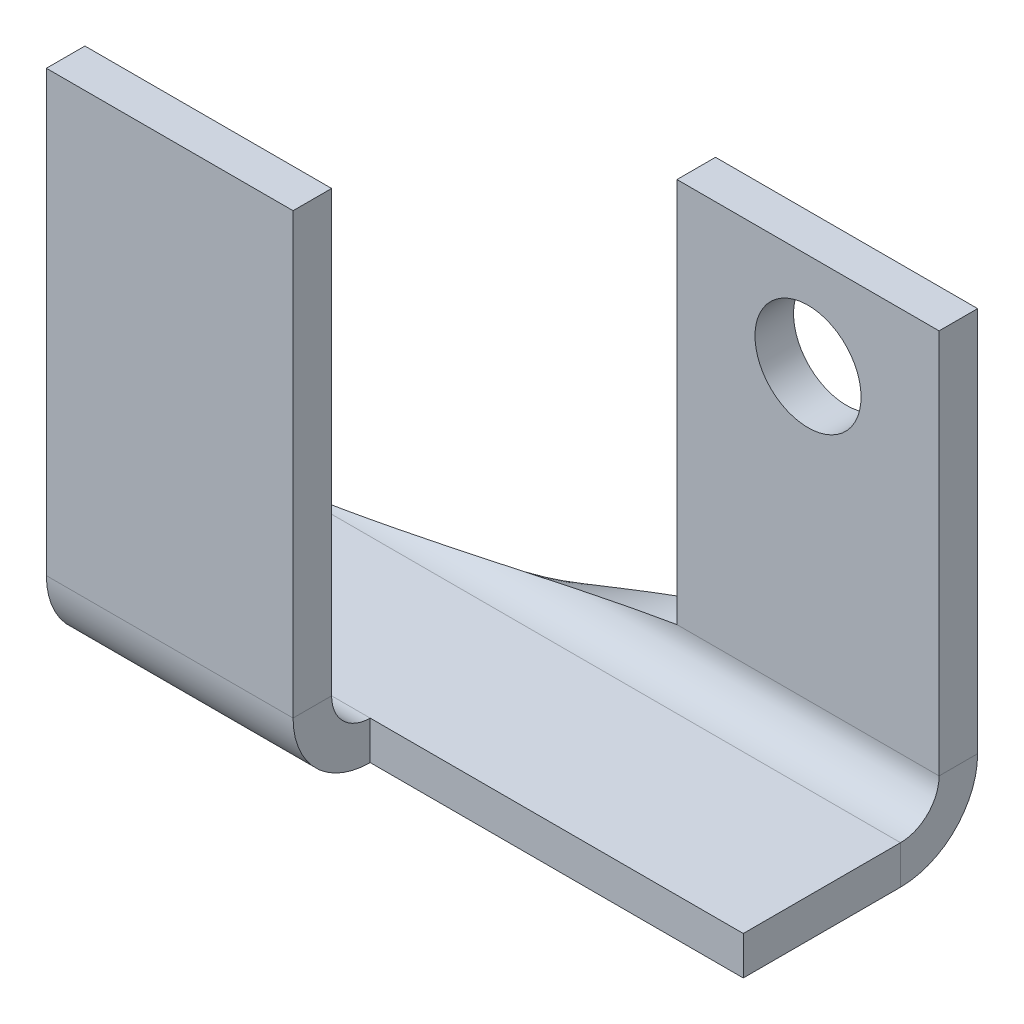
ISO-10303-21;
HEADER;
FILE_DESCRIPTION(('STEP AP214'),'2;1');
FILE_NAME('part.step','',(''),(''),'','','');
FILE_SCHEMA(('AUTOMOTIVE_DESIGN { 1 0 10303 214 1 1 1 1 }'));
ENDSEC;
DATA;
#1=APPLICATION_CONTEXT('core data for automotive mechanical design processes');
#2=APPLICATION_PROTOCOL_DEFINITION('international standard','automotive_design',2000,#1);
#3=PRODUCT_CONTEXT('',#1,'mechanical');
#4=PRODUCT('Part','Part','',(#3));
#5=PRODUCT_RELATED_PRODUCT_CATEGORY('part','',(#4));
#6=PRODUCT_DEFINITION_FORMATION('','',#4);
#7=PRODUCT_DEFINITION_CONTEXT('part definition',#1,'design');
#8=PRODUCT_DEFINITION('design','',#6,#7);
#9=PRODUCT_DEFINITION_SHAPE('','',#8);
#10=(LENGTH_UNIT() NAMED_UNIT(*) SI_UNIT(.MILLI.,.METRE.));
#11=(NAMED_UNIT(*) PLANE_ANGLE_UNIT() SI_UNIT($,.RADIAN.));
#12=(NAMED_UNIT(*) SI_UNIT($,.STERADIAN.) SOLID_ANGLE_UNIT());
#13=UNCERTAINTY_MEASURE_WITH_UNIT(LENGTH_MEASURE(1.E-05),#10,'distance_accuracy_value','');
#14=(GEOMETRIC_REPRESENTATION_CONTEXT(3) GLOBAL_UNCERTAINTY_ASSIGNED_CONTEXT((#13)) GLOBAL_UNIT_ASSIGNED_CONTEXT((#10,
#11,#12)) REPRESENTATION_CONTEXT('',''));
#15=CARTESIAN_POINT('',(0.,0.,0.));
#16=DIRECTION('',(0.,0.,1.));
#17=DIRECTION('',(1.,0.,0.));
#18=AXIS2_PLACEMENT_3D('',#15,#16,#17);
#19=CARTESIAN_POINT('',(10.795,19.05,3.175));
#20=DIRECTION('',(1.,0.,0.));
#21=DIRECTION('',(0.,1.,0.));
#22=AXIS2_PLACEMENT_3D('',#19,#20,#21);
#23=PLANE('',#22);
#24=DIRECTION('',(0.,1.,0.));
#25=VECTOR('',#24,1.);
#26=CARTESIAN_POINT('',(10.795,19.05,3.175));
#27=LINE('',#26,#25);
#28=CARTESIAN_POINT('',(10.795,-12.7,3.175));
#29=VERTEX_POINT('',#28);
#30=CARTESIAN_POINT('',(10.795,19.05,3.175));
#31=VERTEX_POINT('',#30);
#32=EDGE_CURVE('E357',#29,#31,#27,.T.);
#33=ORIENTED_EDGE('',*,*,#32,.F.);
#34=DIRECTION('',(0.,0.,-1.));
#35=VECTOR('',#34,1.);
#36=CARTESIAN_POINT('',(10.795,-12.7,3.175));
#37=LINE('',#36,#35);
#38=CARTESIAN_POINT('',(10.795,-12.7,0.));
#39=VERTEX_POINT('',#38);
#40=EDGE_CURVE('E278',#29,#39,#37,.T.);
#41=ORIENTED_EDGE('',*,*,#40,.T.);
#42=DIRECTION('',(0.,1.,0.));
#43=VECTOR('',#42,1.);
#44=CARTESIAN_POINT('',(10.795,0.,0.));
#45=LINE('',#44,#43);
#46=CARTESIAN_POINT('',(10.795,19.05,0.));
#47=VERTEX_POINT('',#46);
#48=EDGE_CURVE('E281',#39,#47,#45,.T.);
#49=ORIENTED_EDGE('',*,*,#48,.T.);
#50=DIRECTION('',(0.,0.,1.));
#51=VECTOR('',#50,1.);
#52=CARTESIAN_POINT('',(10.795,19.05,3.175));
#53=LINE('',#52,#51);
#54=EDGE_CURVE('E83',#47,#31,#53,.T.);
#55=ORIENTED_EDGE('',*,*,#54,.T.);
#56=EDGE_LOOP('',(#33,#41,#49,#55));
#57=FACE_BOUND('',#56,.T.);
#58=ADVANCED_FACE('F79',(#57),#23,.T.);
#59=CARTESIAN_POINT('',(0.,0.,3.175));
#60=DIRECTION('',(0.,0.,1.));
#61=DIRECTION('',(1.,0.,0.));
#62=AXIS2_PLACEMENT_3D('',#59,#60,#61);
#63=PLANE('',#62);
#64=CARTESIAN_POINT('',(0.,11.1125,3.175));
#65=DIRECTION('',(0.,0.,1.));
#66=DIRECTION('',(1.,0.,0.));
#67=AXIS2_PLACEMENT_3D('',#64,#65,#66);
#68=CIRCLE('',#67,4.3688);
#69=CARTESIAN_POINT('',(4.3688,11.1125,3.175));
#70=VERTEX_POINT('',#69);
#71=EDGE_CURVE('E366',#70,#70,#68,.T.);
#72=ORIENTED_EDGE('',*,*,#71,.F.);
#73=EDGE_LOOP('',(#72));
#74=FACE_BOUND('',#73,.T.);
#75=DIRECTION('',(0.,-1.,0.));
#76=VECTOR('',#75,1.);
#77=CARTESIAN_POINT('',(-10.795,19.05,3.175));
#78=LINE('',#77,#76);
#79=CARTESIAN_POINT('',(-10.795,19.05,3.175));
#80=VERTEX_POINT('',#79);
#81=CARTESIAN_POINT('',(-10.795,-12.7,3.175));
#82=VERTEX_POINT('',#81);
#83=EDGE_CURVE('E362',#80,#82,#78,.T.);
#84=ORIENTED_EDGE('',*,*,#83,.T.);
#85=DIRECTION('',(1.,0.,0.));
#86=VECTOR('',#85,1.);
#87=CARTESIAN_POINT('',(10.795,-12.7,3.175));
#88=LINE('',#87,#86);
#89=EDGE_CURVE('E273',#29,#82,#88,.F.);
#90=ORIENTED_EDGE('',*,*,#89,.F.);
#91=ORIENTED_EDGE('',*,*,#32,.T.);
#92=DIRECTION('',(-1.,0.,0.));
#93=VECTOR('',#92,1.);
#94=CARTESIAN_POINT('',(-10.795,19.05,3.175));
#95=LINE('',#94,#93);
#96=EDGE_CURVE('E360',#31,#80,#95,.T.);
#97=ORIENTED_EDGE('',*,*,#96,.T.);
#98=EDGE_LOOP('',(#84,#90,#91,#97));
#99=FACE_BOUND('',#98,.T.);
#100=ADVANCED_FACE('F319',(#74,#99),#63,.T.);
#101=CARTESIAN_POINT('',(0.,0.,0.));
#102=DIRECTION('',(0.,0.,1.));
#103=DIRECTION('',(1.,0.,0.));
#104=AXIS2_PLACEMENT_3D('',#101,#102,#103);
#105=PLANE('',#104);
#106=CARTESIAN_POINT('',(0.,11.1125,0.));
#107=DIRECTION('',(0.,0.,1.));
#108=DIRECTION('',(1.,0.,0.));
#109=AXIS2_PLACEMENT_3D('',#106,#107,#108);
#110=CIRCLE('',#109,4.3688);
#111=CARTESIAN_POINT('',(4.3688,11.1125,0.));
#112=VERTEX_POINT('',#111);
#113=EDGE_CURVE('E352',#112,#112,#110,.T.);
#114=ORIENTED_EDGE('',*,*,#113,.T.);
#115=EDGE_LOOP('',(#114));
#116=FACE_BOUND('',#115,.T.);
#117=DIRECTION('',(1.,0.,0.));
#118=VECTOR('',#117,1.);
#119=CARTESIAN_POINT('',(10.795,-12.7,0.));
#120=LINE('',#119,#118);
#121=CARTESIAN_POINT('',(-10.795,-12.7,0.));
#122=VERTEX_POINT('',#121);
#123=EDGE_CURVE('E269',#39,#122,#120,.F.);
#124=ORIENTED_EDGE('',*,*,#123,.T.);
#125=DIRECTION('',(0.,1.,0.));
#126=VECTOR('',#125,1.);
#127=CARTESIAN_POINT('',(-10.795,0.,0.));
#128=LINE('',#127,#126);
#129=CARTESIAN_POINT('',(-10.795,19.05,0.));
#130=VERTEX_POINT('',#129);
#131=EDGE_CURVE('E350',#130,#122,#128,.F.);
#132=ORIENTED_EDGE('',*,*,#131,.F.);
#133=DIRECTION('',(1.,0.,0.));
#134=VECTOR('',#133,1.);
#135=CARTESIAN_POINT('',(0.,19.05,0.));
#136=LINE('',#135,#134);
#137=EDGE_CURVE('E343',#47,#130,#136,.F.);
#138=ORIENTED_EDGE('',*,*,#137,.F.);
#139=ORIENTED_EDGE('',*,*,#48,.F.);
#140=EDGE_LOOP('',(#124,#132,#138,#139));
#141=FACE_BOUND('',#140,.T.);
#142=ADVANCED_FACE('F325',(#116,#141),#105,.F.);
#143=CARTESIAN_POINT('',(-10.795,19.05,3.175));
#144=DIRECTION('',(-1.,0.,0.));
#145=DIRECTION('',(0.,-1.,0.));
#146=AXIS2_PLACEMENT_3D('',#143,#144,#145);
#147=PLANE('',#146);
#148=DIRECTION('',(0.,0.,-1.));
#149=VECTOR('',#148,1.);
#150=CARTESIAN_POINT('',(-10.795,-12.7,3.175));
#151=LINE('',#150,#149);
#152=EDGE_CURVE('E102',#82,#122,#151,.T.);
#153=ORIENTED_EDGE('',*,*,#152,.F.);
#154=ORIENTED_EDGE('',*,*,#83,.F.);
#155=DIRECTION('',(0.,0.,1.));
#156=VECTOR('',#155,1.);
#157=CARTESIAN_POINT('',(-10.795,19.05,3.175));
#158=LINE('',#157,#156);
#159=EDGE_CURVE('E13',#130,#80,#158,.T.);
#160=ORIENTED_EDGE('',*,*,#159,.F.);
#161=ORIENTED_EDGE('',*,*,#131,.T.);
#162=EDGE_LOOP('',(#153,#154,#160,#161));
#163=FACE_BOUND('',#162,.T.);
#164=ADVANCED_FACE('F331',(#163),#147,.T.);
#165=CARTESIAN_POINT('',(-10.795,19.05,3.175));
#166=DIRECTION('',(0.,1.,0.));
#167=DIRECTION('',(-1.,0.,0.));
#168=AXIS2_PLACEMENT_3D('',#165,#166,#167);
#169=PLANE('',#168);
#170=ORIENTED_EDGE('',*,*,#137,.T.);
#171=ORIENTED_EDGE('',*,*,#159,.T.);
#172=ORIENTED_EDGE('',*,*,#96,.F.);
#173=ORIENTED_EDGE('',*,*,#54,.F.);
#174=EDGE_LOOP('',(#170,#171,#172,#173));
#175=FACE_BOUND('',#174,.T.);
#176=ADVANCED_FACE('F333',(#175),#169,.T.);
#177=CARTESIAN_POINT('',(0.,11.1125,3.175));
#178=DIRECTION('',(0.,0.,1.));
#179=DIRECTION('',(1.,0.,0.));
#180=AXIS2_PLACEMENT_3D('',#177,#178,#179);
#181=CYLINDRICAL_SURFACE('',#180,4.3688);
#182=ORIENTED_EDGE('',*,*,#71,.T.);
#183=EDGE_LOOP('',(#182));
#184=FACE_BOUND('',#183,.T.);
#185=ORIENTED_EDGE('',*,*,#113,.F.);
#186=EDGE_LOOP('',(#185));
#187=FACE_BOUND('',#186,.T.);
#188=ADVANCED_FACE('F81',(#184,#187),#181,.F.);
#189=CARTESIAN_POINT('',(-10.795,-12.7,-0.0317499999999983));
#190=CARTESIAN_POINT('',(-13.2503791831293,-13.5353846641155,-0.0317499999999983));
#191=CARTESIAN_POINT('',(-15.7056666666667,-14.3704095610098,0.134349870671977));
#192=CARTESIAN_POINT('',(-20.6163333333333,-15.913970427982,0.773713716120212));
#193=CARTESIAN_POINT('',(-23.0716666666667,-16.6218835301999,1.24672612852541));
#194=CARTESIAN_POINT('',(-27.9823333333333,-17.8032738714746,2.42811646980008));
#195=CARTESIAN_POINT('',(-30.4376666666667,-18.2762862838798,3.136029572018));
#196=CARTESIAN_POINT('',(-35.3483333333333,-18.915650129328,4.67959043899015));
#197=CARTESIAN_POINT('',(-37.8036208168707,-19.08175,5.51461533588452));
#198=CARTESIAN_POINT('',(-40.259,-19.08175,6.34999999999998));
#199=CARTESIAN_POINT('',(-10.795,-12.7,0.));
#200=CARTESIAN_POINT('',(-13.2503788512535,-13.5312284656118,0.));
#201=CARTESIAN_POINT('',(-15.7056666666667,-14.3620990656814,0.165273503156196));
#202=CARTESIAN_POINT('',(-20.6163333333333,-15.8979805253552,0.80145643395046));
#203=CARTESIAN_POINT('',(-23.0716666666667,-16.6023716718407,1.27211555077155));
#204=CARTESIAN_POINT('',(-27.9823333333333,-17.7778844492284,2.44762832815928));
#205=CARTESIAN_POINT('',(-30.4376666666667,-18.2485435660495,3.15201947464478));
#206=CARTESIAN_POINT('',(-35.3483333333333,-18.8847264968438,4.68790093431856));
#207=CARTESIAN_POINT('',(-37.8036211487464,-19.05,5.51877153438814));
#208=CARTESIAN_POINT('',(-40.259,-19.05,6.34999999999998));
#209=CARTESIAN_POINT('',(-10.795,-12.7,3.175));
#210=CARTESIAN_POINT('',(-13.2503456636794,-13.1156086152499,3.175));
#211=CARTESIAN_POINT('',(-15.7056666666667,-13.5310495328407,3.2576367515781));
#212=CARTESIAN_POINT('',(-20.6163333333333,-14.2989902626776,3.57572821697523));
#213=CARTESIAN_POINT('',(-23.0716666666667,-14.6511858359204,3.81105777538578));
#214=CARTESIAN_POINT('',(-27.9823333333333,-15.2389422246142,4.39881416407964));
#215=CARTESIAN_POINT('',(-30.4376666666667,-15.4742717830248,4.75100973732239));
#216=CARTESIAN_POINT('',(-35.3483333333333,-15.7923632484219,5.51895046715928));
#217=CARTESIAN_POINT('',(-37.8036543363206,-15.875,5.93439138475006));
#218=CARTESIAN_POINT('',(-40.259,-15.875,6.34999999999999));
#219=CARTESIAN_POINT('',(-10.795,-12.7,3.2070675));
#220=CARTESIAN_POINT('',(-13.2503453284849,-13.1114108547613,3.2070675));
#221=CARTESIAN_POINT('',(-15.7056666666667,-13.522655932559,3.28886962038716));
#222=CARTESIAN_POINT('',(-20.6163333333333,-14.2828404610246,3.60374836198378));
#223=CARTESIAN_POINT('',(-23.0716666666667,-14.6314788589776,3.83670109185438));
#224=CARTESIAN_POINT('',(-27.9823333333333,-15.2132989081456,4.41852114102244));
#225=CARTESIAN_POINT('',(-30.4376666666667,-15.4462516380162,4.76715953897543));
#226=CARTESIAN_POINT('',(-35.3483333333333,-15.7611303796128,5.52734406744097));
#227=CARTESIAN_POINT('',(-37.8036546715151,-15.8429325,5.93858914523872));
#228=CARTESIAN_POINT('',(-40.259,-15.8429325,6.34999999999999));
#229=B_SPLINE_SURFACE_WITH_KNOTS('',1,3,((#189,#190,#191,#192,#193,#194,#195,#196,#197,#198),
(#199,#200,#201,#202,#203,#204,#205,#206,#207,#208),(#209,#210,#211,#212,#213,#214,#215,#216,
#217,#218),(#219,#220,#221,#222,#223,#224,#225,#226,#227,#228)),.UNSPECIFIED.,.F.,.F.,.F.,(2,1,
1,2),(4,2,2,2,4),(-0.01,0.,1.,1.0101),(0.,0.25,0.5,0.75,1.),.UNSPECIFIED.);
#230=DIRECTION('',(0.,1.,0.));
#231=VECTOR('',#230,1.);
#232=CARTESIAN_POINT('',(-40.259,-19.05,6.34999999999998));
#233=LINE('',#232,#231);
#234=CARTESIAN_POINT('',(-40.259,-15.875,6.34999999999999));
#235=VERTEX_POINT('',#234);
#236=CARTESIAN_POINT('',(-40.259,-19.05,6.34999999999998));
#237=VERTEX_POINT('',#236);
#238=EDGE_CURVE('E233',#235,#237,#233,.F.);
#239=CARTESIAN_POINT('',(-10.795,-12.7,3.175));
#240=CARTESIAN_POINT('',(-11.3170301817584,-12.7883569606893,3.17499383275136));
#241=CARTESIAN_POINT('',(-11.8390508257493,-12.8767153491575,3.17868950658351));
#242=CARTESIAN_POINT('',(-12.8830801146619,-13.0528190482286,3.19342827878512));
#243=CARTESIAN_POINT('',(-13.4050887595973,-13.1405643721451,3.20447121709185));
#244=CARTESIAN_POINT('',(-14.9711126430653,-13.4019578775744,3.24853597945584));
#245=CARTESIAN_POINT('',(-16.0151546100313,-13.573768531974,3.29249375682232));
#246=CARTESIAN_POINT('',(-17.7004194132108,-13.8432673029005,3.38598771297229));
#247=CARTESIAN_POINT('',(-18.3416614582962,-13.9439805494162,3.42682983104564));
#248=CARTESIAN_POINT('',(-19.6241722961125,-14.1407039634403,3.51860945017999));
#249=CARTESIAN_POINT('',(-20.265441089042,-14.2367139800794,3.56954727482529));
#250=CARTESIAN_POINT('',(-21.5479807683685,-14.4230229614577,3.68099265357245));
#251=CARTESIAN_POINT('',(-22.1892516547345,-14.5133218760932,3.74150029161454));
#252=CARTESIAN_POINT('',(-23.4718804928938,-14.687253006014,3.87144451250521));
#253=CARTESIAN_POINT('',(-24.1132384449949,-14.7708843387998,3.94088227414808));
#254=CARTESIAN_POINT('',(-25.3959491898609,-14.9305964183499,4.08795477687657));
#255=CARTESIAN_POINT('',(-26.0373019826256,-15.0066772261379,4.16558945170381));
#256=CARTESIAN_POINT('',(-27.3200033388798,-15.1504914600415,4.32824292310226));
#257=CARTESIAN_POINT('',(-27.9613519023726,-15.2182249336056,4.4132616776956));
#258=CARTESIAN_POINT('',(-29.250193195519,-15.345239496993,4.5906409033154));
#259=CARTESIAN_POINT('',(-29.897685914579,-15.4044333791243,4.68306391553563));
#260=CARTESIAN_POINT('',(-31.192676500359,-15.5129444815679,4.87352368034706));
#261=CARTESIAN_POINT('',(-31.8401743670886,-15.5622616535267,4.97156046041856));
#262=CARTESIAN_POINT('',(-33.1351731647733,-15.6504982567879,5.17220750296413));
#263=CARTESIAN_POINT('',(-33.7826740957281,-15.6894176378192,5.27481778754729));
#264=CARTESIAN_POINT('',(-35.0778179362754,-15.7564512734035,5.48354138315279));
#265=CARTESIAN_POINT('',(-35.7254608456165,-15.7845631378202,5.58965546342903));
#266=CARTESIAN_POINT('',(-37.0207485968701,-15.8296584738932,5.80422441941343));
#267=CARTESIAN_POINT('',(-37.6683934387815,-15.846641906623,5.9126793033082));
#268=CARTESIAN_POINT('',(-38.9636917806894,-15.8693239273839,6.13075723094053));
#269=CARTESIAN_POINT('',(-39.6113452806983,-15.8750223828957,6.24038028838072));
#270=CARTESIAN_POINT('',(-40.259,-15.875,6.34999999999999));
#271=B_SPLINE_CURVE_WITH_KNOTS('',3,(#239,#240,#241,#242,#243,#244,#245,#246,#247,#248,#249,
#250,#251,#252,#253,#254,#255,#256,#257,#258,#259,#260,#261,#262,#263,#264,#265,#266,#267,#268,
#269,#270),.UNSPECIFIED.,.F.,.F.,(4,2,2,2,2,2,2,2,2,2,2,2,2,2,2,4),(0.,1.58833351176632,
3.17663242226272,6.35314267148717,8.30422236168966,10.2553645973779,12.206523948176,
14.1579411208028,16.1093425206852,18.0607328277471,20.0308209606053,22.0009187381845,
23.971026040582,25.9415687917599,27.9121184357325,29.8826912197033),.UNSPECIFIED.);
#272=EDGE_CURVE('E270',#82,#235,#271,.T.);
#273=CARTESIAN_POINT('',(-10.795,-12.7,0.));
#274=CARTESIAN_POINT('',(-11.1326600694282,-12.8143076299897,-3.00113330999505E-06));
#275=CARTESIAN_POINT('',(-11.4703208666533,-12.9286127594259,0.00308640933460506));
#276=CARTESIAN_POINT('',(-12.14562439545,-13.1568846032254,0.0154273462654258));
#277=CARTESIAN_POINT('',(-12.4832671270346,-13.2708513351309,0.0246785475014446));
#278=CARTESIAN_POINT('',(-13.1585419503523,-13.4981221783554,0.0493200459068103));
#279=CARTESIAN_POINT('',(-13.4961740421355,-13.6114263066622,0.0647101849803575));
#280=CARTESIAN_POINT('',(-14.1713569282835,-13.8370146213128,0.101579679326589));
#281=CARTESIAN_POINT('',(-14.5089077229147,-13.9492990434685,0.123057587752193));
#282=CARTESIAN_POINT('',(-15.1840186339755,-14.172546682287,0.172041935211696));
#283=CARTESIAN_POINT('',(-15.5215787504327,-14.28350986686,0.199548520354942));
#284=CARTESIAN_POINT('',(-16.1967154680791,-14.5037892297678,0.260508472006541));
#285=CARTESIAN_POINT('',(-16.5342920692517,-14.6131053257727,0.293962134717659));
#286=CARTESIAN_POINT('',(-17.4178126971699,-14.8966402186092,0.389176441521787));
#287=CARTESIAN_POINT('',(-17.9637640829212,-15.0692738745769,0.455664331360029));
#288=CARTESIAN_POINT('',(-19.0556997118195,-15.4080917187254,0.603444008942429));
#289=CARTESIAN_POINT('',(-19.6016839546214,-15.5742754591045,0.684736822333453));
#290=CARTESIAN_POINT('',(-20.6936535938439,-15.8989352304852,0.861514394418602));
#291=CARTESIAN_POINT('',(-21.2396389902352,-16.0574111962338,0.956999273232934));
#292=CARTESIAN_POINT('',(-22.3318759934754,-16.3655069218996,1.16147809936072));
#293=CARTESIAN_POINT('',(-22.8781275999277,-16.5151223126668,1.27047863062548));
#294=CARTESIAN_POINT('',(-23.9706339143225,-16.8042590121302,1.50110762736918));
#295=CARTESIAN_POINT('',(-24.5168886222387,-16.943780367894,1.622736033959));
#296=CARTESIAN_POINT('',(-25.6094178650619,-17.2116863060636,1.87770944850304));
#297=CARTESIAN_POINT('',(-26.1556923999033,-17.3400704499758,2.0110549173649));
#298=CARTESIAN_POINT('',(-27.2662368986623,-17.5887447844376,2.2930105088699));
#299=CARTESIAN_POINT('',(-27.8305069062801,-17.7086290632471,2.44197876141669));
#300=CARTESIAN_POINT('',(-28.9590963041381,-17.9345022562667,2.7501413267194));
#301=CARTESIAN_POINT('',(-29.5234156938341,-18.0404898156951,2.9093366342532));
#302=CARTESIAN_POINT('',(-30.6521009801673,-18.2376837780192,3.23663107518822));
#303=CARTESIAN_POINT('',(-31.2164668771978,-18.328889103627,3.40473085633926));
#304=CARTESIAN_POINT('',(-32.3452266152109,-18.4957799231125,3.74847388609253));
#305=CARTESIAN_POINT('',(-32.9096204562171,-18.5714646617928,3.92411750125829));
#306=CARTESIAN_POINT('',(-34.0394402548408,-18.7068157432068,4.28183590968632));
#307=CARTESIAN_POINT('',(-34.6048662143923,-18.7664525702901,4.46392186550515));
#308=CARTESIAN_POINT('',(-35.7357036290019,-18.8690432787311,4.83275015610213));
#309=CARTESIAN_POINT('',(-36.3011150841507,-18.9119974079374,5.01949242165939));
#310=CARTESIAN_POINT('',(-37.431936599175,-18.9808571859919,5.39608552994033));
#311=CARTESIAN_POINT('',(-37.9973466590352,-19.0067629475051,5.58593635211247));
#312=CARTESIAN_POINT('',(-39.1281705749281,-19.041346996644,5.96719188478875));
#313=CARTESIAN_POINT('',(-39.6935844309656,-19.0500252564657,6.15859659780027));
#314=CARTESIAN_POINT('',(-40.259,-19.05,6.34999999999998));
#315=B_SPLINE_CURVE_WITH_KNOTS('',3,(#273,#274,#275,#276,#277,#278,#279,#280,#281,#282,#283,
#284,#285,#286,#287,#288,#289,#290,#291,#292,#293,#294,#295,#296,#297,#298,#299,#300,#301,#302,
#303,#304,#305,#306,#307,#308,#309,#310,#311,#312,#313,#314),.UNSPECIFIED.,.F.,.F.,(4,2,2,2,2,2,
2,2,2,2,2,2,2,2,2,2,2,2,2,2,4),(0.,1.06943724421026,2.13881804668149,3.20817131121315,
4.27727064115579,5.34639588436051,6.41557439181441,8.14466008613802,9.87386561265065,
11.6030857758175,13.3331516371096,15.0632094307361,16.7933353091855,18.5804509615344,
20.3677407092382,22.1551606511329,23.9426675442882,25.7334399285103,27.5241857068894,
29.3149196509222,31.1056564850822),.UNSPECIFIED.);
#316=EDGE_CURVE('E277',#122,#237,#315,.T.);
#317=ORIENTED_EDGE('',*,*,#238,.F.);
#318=ORIENTED_EDGE('',*,*,#272,.F.);
#319=ORIENTED_EDGE('',*,*,#152,.T.);
#320=ORIENTED_EDGE('',*,*,#316,.T.);
#321=EDGE_LOOP('',(#317,#318,#319,#320));
#322=FACE_BOUND('',#321,.T.);
#323=ADVANCED_FACE('F296',(#322),#229,.F.);
#324=CARTESIAN_POINT('',(10.795,-12.7,6.35));
#325=DIRECTION('',(-1.,0.,0.));
#326=DIRECTION('',(0.,0.,1.));
#327=AXIS2_PLACEMENT_3D('',#324,#325,#326);
#328=PLANE('',#327);
#329=CARTESIAN_POINT('',(10.795,-12.7,6.35));
#330=DIRECTION('',(1.,0.,0.));
#331=DIRECTION('',(0.,0.,-1.));
#332=AXIS2_PLACEMENT_3D('',#329,#330,#331);
#333=CIRCLE('',#332,3.175);
#334=CARTESIAN_POINT('',(10.795,-15.875,6.34999999999999));
#335=VERTEX_POINT('',#334);
#336=EDGE_CURVE('E237',#335,#29,#333,.T.);
#337=ORIENTED_EDGE('',*,*,#336,.F.);
#338=DIRECTION('',(0.,1.,0.));
#339=VECTOR('',#338,1.);
#340=CARTESIAN_POINT('',(10.795,-15.875,6.34999999999999));
#341=LINE('',#340,#339);
#342=CARTESIAN_POINT('',(10.795,-19.05,6.34999999999998));
#343=VERTEX_POINT('',#342);
#344=EDGE_CURVE('E259',#335,#343,#341,.F.);
#345=ORIENTED_EDGE('',*,*,#344,.T.);
#346=CARTESIAN_POINT('',(10.795,-12.7,6.35));
#347=DIRECTION('',(1.,0.,0.));
#348=DIRECTION('',(0.,0.,-1.));
#349=AXIS2_PLACEMENT_3D('',#346,#347,#348);
#350=CIRCLE('',#349,6.35);
#351=EDGE_CURVE('E266',#343,#39,#350,.T.);
#352=ORIENTED_EDGE('',*,*,#351,.T.);
#353=ORIENTED_EDGE('',*,*,#40,.F.);
#354=EDGE_LOOP('',(#337,#345,#352,#353));
#355=FACE_BOUND('',#354,.T.);
#356=ADVANCED_FACE('F306',(#355),#328,.F.);
#357=CARTESIAN_POINT('',(10.795,-12.7,6.35));
#358=DIRECTION('',(1.,0.,0.));
#359=DIRECTION('',(0.,-1.,0.));
#360=AXIS2_PLACEMENT_3D('',#357,#358,#359);
#361=CYLINDRICAL_SURFACE('',#360,6.35);
#362=ORIENTED_EDGE('',*,*,#123,.F.);
#363=ORIENTED_EDGE('',*,*,#351,.F.);
#364=DIRECTION('',(1.,0.,0.));
#365=VECTOR('',#364,1.);
#366=CARTESIAN_POINT('',(-40.259,-19.05,6.34999999999998));
#367=LINE('',#366,#365);
#368=EDGE_CURVE('E257',#343,#237,#367,.F.);
#369=ORIENTED_EDGE('',*,*,#368,.T.);
#370=ORIENTED_EDGE('',*,*,#316,.F.);
#371=EDGE_LOOP('',(#362,#363,#369,#370));
#372=FACE_BOUND('',#371,.T.);
#373=ADVANCED_FACE('F301',(#372),#361,.T.);
#374=CARTESIAN_POINT('',(10.795,-12.7,6.35));
#375=DIRECTION('',(1.,0.,0.));
#376=DIRECTION('',(0.,-1.,0.));
#377=AXIS2_PLACEMENT_3D('',#374,#375,#376);
#378=CYLINDRICAL_SURFACE('',#377,3.175);
#379=ORIENTED_EDGE('',*,*,#89,.T.);
#380=ORIENTED_EDGE('',*,*,#272,.T.);
#381=DIRECTION('',(1.,0.,0.));
#382=VECTOR('',#381,1.);
#383=CARTESIAN_POINT('',(-40.259,-15.875,6.34999999999999));
#384=LINE('',#383,#382);
#385=EDGE_CURVE('E262',#235,#335,#384,.T.);
#386=ORIENTED_EDGE('',*,*,#385,.T.);
#387=ORIENTED_EDGE('',*,*,#336,.T.);
#388=EDGE_LOOP('',(#379,#380,#386,#387));
#389=FACE_BOUND('',#388,.T.);
#390=ADVANCED_FACE('F305',(#389),#378,.F.);
#391=CARTESIAN_POINT('',(10.795,-19.0500000000001,19.304));
#392=DIRECTION('',(-1.,0.,0.));
#393=DIRECTION('',(0.,0.,1.));
#394=AXIS2_PLACEMENT_3D('',#391,#392,#393);
#395=PLANE('',#394);
#396=ORIENTED_EDGE('',*,*,#344,.F.);
#397=DIRECTION('',(0.,0.,-1.));
#398=VECTOR('',#397,1.);
#399=CARTESIAN_POINT('',(10.795,-15.8750000000001,19.304));
#400=LINE('',#399,#398);
#401=CARTESIAN_POINT('',(10.795,-15.8750000000001,19.304));
#402=VERTEX_POINT('',#401);
#403=EDGE_CURVE('E255',#335,#402,#400,.F.);
#404=ORIENTED_EDGE('',*,*,#403,.T.);
#405=DIRECTION('',(0.,1.,0.));
#406=VECTOR('',#405,1.);
#407=CARTESIAN_POINT('',(10.795,-19.0500000000001,19.304));
#408=LINE('',#407,#406);
#409=CARTESIAN_POINT('',(10.795,-19.0500000000001,19.304));
#410=VERTEX_POINT('',#409);
#411=EDGE_CURVE('E234',#410,#402,#408,.T.);
#412=ORIENTED_EDGE('',*,*,#411,.F.);
#413=DIRECTION('',(0.,0.,1.));
#414=VECTOR('',#413,1.);
#415=CARTESIAN_POINT('',(10.795,-19.05,0.));
#416=LINE('',#415,#414);
#417=EDGE_CURVE('E247',#343,#410,#416,.T.);
#418=ORIENTED_EDGE('',*,*,#417,.F.);
#419=EDGE_LOOP('',(#396,#404,#412,#418));
#420=FACE_BOUND('',#419,.T.);
#421=ADVANCED_FACE('F308',(#420),#395,.F.);
#422=CARTESIAN_POINT('',(-40.259,-19.0500000000001,19.304));
#423=DIRECTION('',(1.,0.,0.));
#424=DIRECTION('',(0.,0.,-1.));
#425=AXIS2_PLACEMENT_3D('',#422,#423,#424);
#426=PLANE('',#425);
#427=ORIENTED_EDGE('',*,*,#238,.T.);
#428=DIRECTION('',(0.,0.,-1.));
#429=VECTOR('',#428,1.);
#430=CARTESIAN_POINT('',(-40.259,-19.05,0.));
#431=LINE('',#430,#429);
#432=CARTESIAN_POINT('',(-40.259,-19.0500000000001,19.304));
#433=VERTEX_POINT('',#432);
#434=EDGE_CURVE('E241',#433,#237,#431,.T.);
#435=ORIENTED_EDGE('',*,*,#434,.F.);
#436=DIRECTION('',(0.,1.,0.));
#437=VECTOR('',#436,1.);
#438=CARTESIAN_POINT('',(-40.259,-19.0500000000001,19.304));
#439=LINE('',#438,#437);
#440=CARTESIAN_POINT('',(-40.259,-15.8750000000001,19.304));
#441=VERTEX_POINT('',#440);
#442=EDGE_CURVE('E238',#433,#441,#439,.T.);
#443=ORIENTED_EDGE('',*,*,#442,.T.);
#444=DIRECTION('',(0.,0.,1.));
#445=VECTOR('',#444,1.);
#446=CARTESIAN_POINT('',(-40.259,-15.8750000000001,19.304));
#447=LINE('',#446,#445);
#448=EDGE_CURVE('E249',#441,#235,#447,.F.);
#449=ORIENTED_EDGE('',*,*,#448,.T.);
#450=EDGE_LOOP('',(#427,#435,#443,#449));
#451=FACE_BOUND('',#450,.T.);
#452=ADVANCED_FACE('F316',(#451),#426,.F.);
#453=CARTESIAN_POINT('',(0.,-19.05,0.));
#454=DIRECTION('',(0.,1.,0.));
#455=DIRECTION('',(0.,0.,1.));
#456=AXIS2_PLACEMENT_3D('',#453,#454,#455);
#457=PLANE('',#456);
#458=ORIENTED_EDGE('',*,*,#368,.F.);
#459=ORIENTED_EDGE('',*,*,#417,.T.);
#460=DIRECTION('',(-1.,0.,0.));
#461=VECTOR('',#460,1.);
#462=CARTESIAN_POINT('',(0.,-19.0500000000001,19.304));
#463=LINE('',#462,#461);
#464=CARTESIAN_POINT('',(-19.939,-19.0500000000001,19.304));
#465=VERTEX_POINT('',#464);
#466=EDGE_CURVE('E244',#410,#465,#463,.T.);
#467=ORIENTED_EDGE('',*,*,#466,.T.);
#468=DIRECTION('',(1.,0.,0.));
#469=VECTOR('',#468,1.);
#470=CARTESIAN_POINT('',(-19.939,-19.0500000000001,19.304));
#471=LINE('',#470,#469);
#472=EDGE_CURVE('E215',#465,#433,#471,.F.);
#473=ORIENTED_EDGE('',*,*,#472,.T.);
#474=ORIENTED_EDGE('',*,*,#434,.T.);
#475=EDGE_LOOP('',(#458,#459,#467,#473,#474));
#476=FACE_BOUND('',#475,.T.);
#477=ADVANCED_FACE('F379',(#476),#457,.F.);
#478=CARTESIAN_POINT('',(0.,-15.875,0.));
#479=DIRECTION('',(0.,1.,0.));
#480=DIRECTION('',(0.,0.,1.));
#481=AXIS2_PLACEMENT_3D('',#478,#479,#480);
#482=PLANE('',#481);
#483=ORIENTED_EDGE('',*,*,#403,.F.);
#484=ORIENTED_EDGE('',*,*,#385,.F.);
#485=ORIENTED_EDGE('',*,*,#448,.F.);
#486=DIRECTION('',(1.,0.,0.));
#487=VECTOR('',#486,1.);
#488=CARTESIAN_POINT('',(-19.939,-15.8750000000001,19.304));
#489=LINE('',#488,#487);
#490=CARTESIAN_POINT('',(-19.939,-15.8750000000001,19.304));
#491=VERTEX_POINT('',#490);
#492=EDGE_CURVE('E226',#491,#441,#489,.F.);
#493=ORIENTED_EDGE('',*,*,#492,.F.);
#494=DIRECTION('',(1.,0.,0.));
#495=VECTOR('',#494,1.);
#496=CARTESIAN_POINT('',(-32.893,-15.8750000000001,19.304));
#497=LINE('',#496,#495);
#498=EDGE_CURVE('E252',#402,#491,#497,.F.);
#499=ORIENTED_EDGE('',*,*,#498,.F.);
#500=EDGE_LOOP('',(#483,#484,#485,#493,#499));
#501=FACE_BOUND('',#500,.T.);
#502=ADVANCED_FACE('F395',(#501),#482,.T.);
#503=CARTESIAN_POINT('',(-32.893,-19.0500000000001,19.304));
#504=DIRECTION('',(0.,0.,-1.));
#505=DIRECTION('',(0.,1.,0.));
#506=AXIS2_PLACEMENT_3D('',#503,#504,#505);
#507=PLANE('',#506);
#508=ORIENTED_EDGE('',*,*,#498,.T.);
#509=DIRECTION('',(0.,-1.,0.));
#510=VECTOR('',#509,1.);
#511=CARTESIAN_POINT('',(-19.939,-15.8750000000001,19.304));
#512=LINE('',#511,#510);
#513=EDGE_CURVE('E221',#491,#465,#512,.T.);
#514=ORIENTED_EDGE('',*,*,#513,.T.);
#515=ORIENTED_EDGE('',*,*,#466,.F.);
#516=ORIENTED_EDGE('',*,*,#411,.T.);
#517=EDGE_LOOP('',(#508,#514,#515,#516));
#518=FACE_BOUND('',#517,.T.);
#519=ADVANCED_FACE('F385',(#518),#507,.F.);
#520=CARTESIAN_POINT('',(-40.259,-12.7000000000001,19.304));
#521=DIRECTION('',(-1.,0.,0.));
#522=DIRECTION('',(0.,-1.,0.));
#523=AXIS2_PLACEMENT_3D('',#520,#521,#522);
#524=PLANE('',#523);
#525=DIRECTION('',(0.,0.,-1.));
#526=VECTOR('',#525,1.);
#527=CARTESIAN_POINT('',(-40.259,-12.7000000000001,25.654));
#528=LINE('',#527,#526);
#529=CARTESIAN_POINT('',(-40.259,-12.7000000000001,22.479));
#530=VERTEX_POINT('',#529);
#531=CARTESIAN_POINT('',(-40.259,-12.7000000000001,25.654));
#532=VERTEX_POINT('',#531);
#533=EDGE_CURVE('E199',#530,#532,#528,.F.);
#534=ORIENTED_EDGE('',*,*,#533,.F.);
#535=CARTESIAN_POINT('',(-40.259,-12.7000000000001,19.304));
#536=DIRECTION('',(1.,0.,0.));
#537=DIRECTION('',(0.,1.,0.));
#538=AXIS2_PLACEMENT_3D('',#535,#536,#537);
#539=CIRCLE('',#538,3.17499999999999);
#540=EDGE_CURVE('E223',#441,#530,#539,.F.);
#541=ORIENTED_EDGE('',*,*,#540,.F.);
#542=ORIENTED_EDGE('',*,*,#442,.F.);
#543=CARTESIAN_POINT('',(-40.259,-12.7000000000001,19.304));
#544=DIRECTION('',(1.,0.,0.));
#545=DIRECTION('',(0.,1.,0.));
#546=AXIS2_PLACEMENT_3D('',#543,#544,#545);
#547=CIRCLE('',#546,6.34999999999999);
#548=EDGE_CURVE('E218',#433,#532,#547,.F.);
#549=ORIENTED_EDGE('',*,*,#548,.T.);
#550=EDGE_LOOP('',(#534,#541,#542,#549));
#551=FACE_BOUND('',#550,.T.);
#552=ADVANCED_FACE('F403',(#551),#524,.T.);
#553=CARTESIAN_POINT('',(-19.939,-12.7000000000001,19.304));
#554=DIRECTION('',(-1.,0.,0.));
#555=DIRECTION('',(0.,-1.,0.));
#556=AXIS2_PLACEMENT_3D('',#553,#554,#555);
#557=PLANE('',#556);
#558=CARTESIAN_POINT('',(-19.939,-12.7000000000001,19.304));
#559=DIRECTION('',(1.,0.,0.));
#560=DIRECTION('',(0.,1.,0.));
#561=AXIS2_PLACEMENT_3D('',#558,#559,#560);
#562=CIRCLE('',#561,3.17499999999999);
#563=CARTESIAN_POINT('',(-19.939,-12.7000000000001,22.479));
#564=VERTEX_POINT('',#563);
#565=EDGE_CURVE('E228',#564,#491,#562,.T.);
#566=ORIENTED_EDGE('',*,*,#565,.F.);
#567=DIRECTION('',(0.,0.,-1.));
#568=VECTOR('',#567,1.);
#569=CARTESIAN_POINT('',(-19.939,-12.7000000000001,22.479));
#570=LINE('',#569,#568);
#571=CARTESIAN_POINT('',(-19.939,-12.7000000000001,25.654));
#572=VERTEX_POINT('',#571);
#573=EDGE_CURVE('E210',#564,#572,#570,.F.);
#574=ORIENTED_EDGE('',*,*,#573,.T.);
#575=CARTESIAN_POINT('',(-19.939,-12.7000000000001,19.304));
#576=DIRECTION('',(1.,0.,0.));
#577=DIRECTION('',(0.,1.,0.));
#578=AXIS2_PLACEMENT_3D('',#575,#576,#577);
#579=CIRCLE('',#578,6.34999999999999);
#580=EDGE_CURVE('E94',#572,#465,#579,.T.);
#581=ORIENTED_EDGE('',*,*,#580,.T.);
#582=ORIENTED_EDGE('',*,*,#513,.F.);
#583=EDGE_LOOP('',(#566,#574,#581,#582));
#584=FACE_BOUND('',#583,.T.);
#585=ADVANCED_FACE('F412',(#584),#557,.F.);
#586=CARTESIAN_POINT('',(-19.939,-12.7000000000001,19.304));
#587=DIRECTION('',(1.,0.,0.));
#588=DIRECTION('',(0.,0.,1.));
#589=AXIS2_PLACEMENT_3D('',#586,#587,#588);
#590=CYLINDRICAL_SURFACE('',#589,6.34999999999999);
#591=ORIENTED_EDGE('',*,*,#472,.F.);
#592=ORIENTED_EDGE('',*,*,#580,.F.);
#593=DIRECTION('',(1.,0.,0.));
#594=VECTOR('',#593,1.);
#595=CARTESIAN_POINT('',(-40.259,-12.7000000000001,25.654));
#596=LINE('',#595,#594);
#597=EDGE_CURVE('E208',#572,#532,#596,.F.);
#598=ORIENTED_EDGE('',*,*,#597,.T.);
#599=ORIENTED_EDGE('',*,*,#548,.F.);
#600=EDGE_LOOP('',(#591,#592,#598,#599));
#601=FACE_BOUND('',#600,.T.);
#602=ADVANCED_FACE('F404',(#601),#590,.T.);
#603=CARTESIAN_POINT('',(-19.939,-12.7000000000001,19.304));
#604=DIRECTION('',(1.,0.,0.));
#605=DIRECTION('',(0.,0.,1.));
#606=AXIS2_PLACEMENT_3D('',#603,#604,#605);
#607=CYLINDRICAL_SURFACE('',#606,3.17499999999999);
#608=ORIENTED_EDGE('',*,*,#492,.T.);
#609=ORIENTED_EDGE('',*,*,#540,.T.);
#610=DIRECTION('',(1.,0.,0.));
#611=VECTOR('',#610,1.);
#612=CARTESIAN_POINT('',(-40.259,-12.7000000000001,22.479));
#613=LINE('',#612,#611);
#614=EDGE_CURVE('E212',#530,#564,#613,.T.);
#615=ORIENTED_EDGE('',*,*,#614,.T.);
#616=ORIENTED_EDGE('',*,*,#565,.T.);
#617=EDGE_LOOP('',(#608,#609,#615,#616));
#618=FACE_BOUND('',#617,.T.);
#619=ADVANCED_FACE('F399',(#618),#607,.F.);
#620=CARTESIAN_POINT('',(-40.259,-15.8750000000001,25.654));
#621=DIRECTION('',(1.,0.,0.));
#622=DIRECTION('',(0.,0.,-1.));
#623=AXIS2_PLACEMENT_3D('',#620,#621,#622);
#624=PLANE('',#623);
#625=ORIENTED_EDGE('',*,*,#533,.T.);
#626=DIRECTION('',(0.,-1.,0.));
#627=VECTOR('',#626,1.);
#628=CARTESIAN_POINT('',(-40.259,0.,25.654));
#629=LINE('',#628,#627);
#630=CARTESIAN_POINT('',(-40.259,23.4949999999999,25.654));
#631=VERTEX_POINT('',#630);
#632=EDGE_CURVE('E180',#631,#532,#629,.T.);
#633=ORIENTED_EDGE('',*,*,#632,.F.);
#634=DIRECTION('',(0.,0.,-1.));
#635=VECTOR('',#634,1.);
#636=CARTESIAN_POINT('',(-40.259,23.4949999999999,25.654));
#637=LINE('',#636,#635);
#638=CARTESIAN_POINT('',(-40.259,23.4949999999999,22.479));
#639=VERTEX_POINT('',#638);
#640=EDGE_CURVE('E186',#631,#639,#637,.T.);
#641=ORIENTED_EDGE('',*,*,#640,.T.);
#642=DIRECTION('',(0.,1.,0.));
#643=VECTOR('',#642,1.);
#644=CARTESIAN_POINT('',(-40.259,-15.8750000000001,22.479));
#645=LINE('',#644,#643);
#646=EDGE_CURVE('E206',#639,#530,#645,.F.);
#647=ORIENTED_EDGE('',*,*,#646,.T.);
#648=EDGE_LOOP('',(#625,#633,#641,#647));
#649=FACE_BOUND('',#648,.T.);
#650=ADVANCED_FACE('F198',(#649),#624,.F.);
#651=CARTESIAN_POINT('',(-19.939,-15.8750000000001,25.654));
#652=DIRECTION('',(-1.,0.,0.));
#653=DIRECTION('',(0.,0.,1.));
#654=AXIS2_PLACEMENT_3D('',#651,#652,#653);
#655=PLANE('',#654);
#656=ORIENTED_EDGE('',*,*,#573,.F.);
#657=DIRECTION('',(0.,-1.,0.));
#658=VECTOR('',#657,1.);
#659=CARTESIAN_POINT('',(-19.939,-15.8750000000001,22.479));
#660=LINE('',#659,#658);
#661=CARTESIAN_POINT('',(-19.939,23.4949999999999,22.479));
#662=VERTEX_POINT('',#661);
#663=EDGE_CURVE('E202',#564,#662,#660,.F.);
#664=ORIENTED_EDGE('',*,*,#663,.T.);
#665=DIRECTION('',(0.,0.,-1.));
#666=VECTOR('',#665,1.);
#667=CARTESIAN_POINT('',(-19.939,23.4949999999999,25.654));
#668=LINE('',#667,#666);
#669=CARTESIAN_POINT('',(-19.939,23.4949999999999,25.654));
#670=VERTEX_POINT('',#669);
#671=EDGE_CURVE('E195',#670,#662,#668,.T.);
#672=ORIENTED_EDGE('',*,*,#671,.F.);
#673=DIRECTION('',(0.,1.,0.));
#674=VECTOR('',#673,1.);
#675=CARTESIAN_POINT('',(-19.939,0.,25.654));
#676=LINE('',#675,#674);
#677=EDGE_CURVE('E182',#572,#670,#676,.T.);
#678=ORIENTED_EDGE('',*,*,#677,.F.);
#679=EDGE_LOOP('',(#656,#664,#672,#678));
#680=FACE_BOUND('',#679,.T.);
#681=ADVANCED_FACE('F407',(#680),#655,.F.);
#682=CARTESIAN_POINT('',(0.,0.,25.654));
#683=DIRECTION('',(0.,0.,-1.));
#684=DIRECTION('',(-1.,0.,0.));
#685=AXIS2_PLACEMENT_3D('',#682,#683,#684);
#686=PLANE('',#685);
#687=ORIENTED_EDGE('',*,*,#597,.F.);
#688=ORIENTED_EDGE('',*,*,#677,.T.);
#689=DIRECTION('',(-1.,0.,0.));
#690=VECTOR('',#689,1.);
#691=CARTESIAN_POINT('',(0.,23.4949999999999,25.654));
#692=LINE('',#691,#690);
#693=EDGE_CURVE('E175',#670,#631,#692,.T.);
#694=ORIENTED_EDGE('',*,*,#693,.T.);
#695=ORIENTED_EDGE('',*,*,#632,.T.);
#696=EDGE_LOOP('',(#687,#688,#694,#695));
#697=FACE_BOUND('',#696,.T.);
#698=ADVANCED_FACE('F178',(#697),#686,.F.);
#699=CARTESIAN_POINT('',(0.,0.,22.479));
#700=DIRECTION('',(0.,0.,-1.));
#701=DIRECTION('',(-1.,0.,0.));
#702=AXIS2_PLACEMENT_3D('',#699,#700,#701);
#703=PLANE('',#702);
#704=ORIENTED_EDGE('',*,*,#663,.F.);
#705=ORIENTED_EDGE('',*,*,#614,.F.);
#706=ORIENTED_EDGE('',*,*,#646,.F.);
#707=DIRECTION('',(1.,0.,0.));
#708=VECTOR('',#707,1.);
#709=CARTESIAN_POINT('',(-40.259,23.4949999999999,22.479));
#710=LINE('',#709,#708);
#711=EDGE_CURVE('E191',#662,#639,#710,.F.);
#712=ORIENTED_EDGE('',*,*,#711,.F.);
#713=EDGE_LOOP('',(#704,#705,#706,#712));
#714=FACE_BOUND('',#713,.T.);
#715=ADVANCED_FACE('F411',(#714),#703,.T.);
#716=CARTESIAN_POINT('',(-40.259,23.4949999999999,25.654));
#717=DIRECTION('',(0.,-1.,0.));
#718=DIRECTION('',(0.,0.,-1.));
#719=AXIS2_PLACEMENT_3D('',#716,#717,#718);
#720=PLANE('',#719);
#721=ORIENTED_EDGE('',*,*,#711,.T.);
#722=ORIENTED_EDGE('',*,*,#640,.F.);
#723=ORIENTED_EDGE('',*,*,#693,.F.);
#724=ORIENTED_EDGE('',*,*,#671,.T.);
#725=EDGE_LOOP('',(#721,#722,#723,#724));
#726=FACE_BOUND('',#725,.T.);
#727=ADVANCED_FACE('F189',(#726),#720,.F.);
#728=CLOSED_SHELL('',(#58,#100,#142,#164,#176,#188,#323,#356,#373,#390,#421,#452,#477,#502,#519,
#552,#585,#602,#619,#650,#681,#698,#715,#727));
#729=MANIFOLD_SOLID_BREP('B2',#728);
#730=ADVANCED_BREP_SHAPE_REPRESENTATION('',(#18,#729),#14);
#731=SHAPE_DEFINITION_REPRESENTATION(#9,#730);
ENDSEC;
END-ISO-10303-21;
